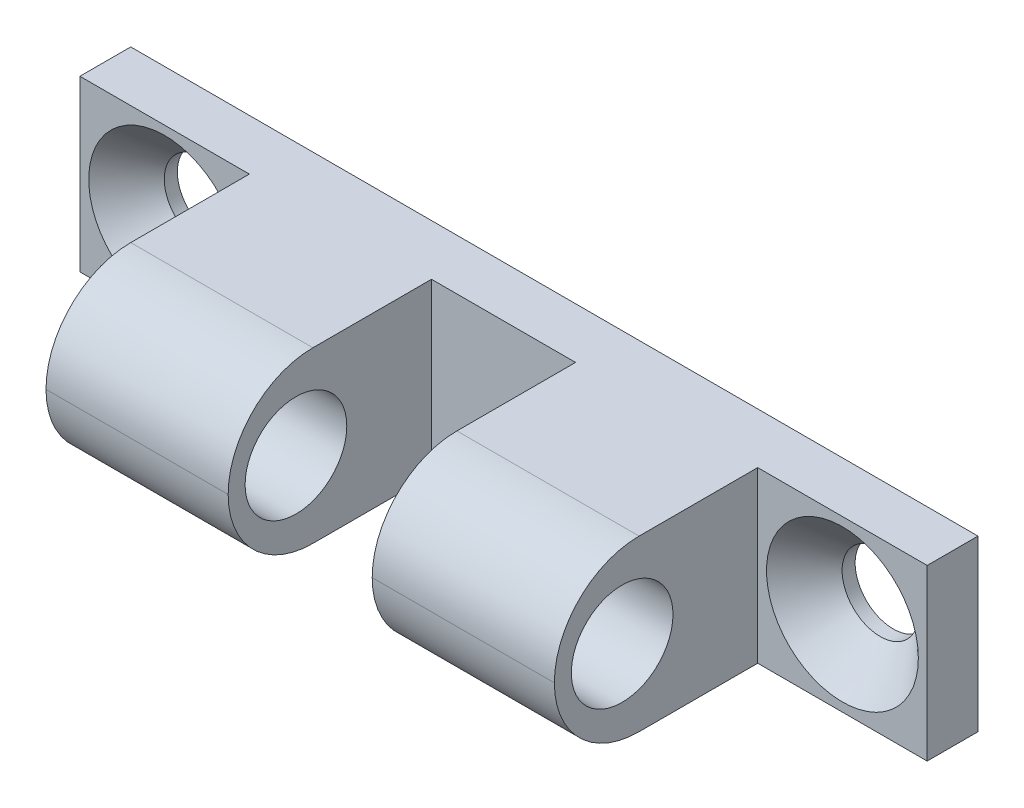
ISO-10303-21;
HEADER;
FILE_DESCRIPTION(('STEP AP214'),'2;1');
FILE_NAME('part.step','',(''),(''),'','','');
FILE_SCHEMA(('AUTOMOTIVE_DESIGN { 1 0 10303 214 1 1 1 1 }'));
ENDSEC;
DATA;
#1=APPLICATION_CONTEXT('core data for automotive mechanical design processes');
#2=APPLICATION_PROTOCOL_DEFINITION('international standard','automotive_design',2000,#1);
#3=PRODUCT_CONTEXT('',#1,'mechanical');
#4=PRODUCT('Part','Part','',(#3));
#5=PRODUCT_RELATED_PRODUCT_CATEGORY('part','',(#4));
#6=PRODUCT_DEFINITION_FORMATION('','',#4);
#7=PRODUCT_DEFINITION_CONTEXT('part definition',#1,'design');
#8=PRODUCT_DEFINITION('design','',#6,#7);
#9=PRODUCT_DEFINITION_SHAPE('','',#8);
#10=(LENGTH_UNIT() NAMED_UNIT(*) SI_UNIT(.MILLI.,.METRE.));
#11=(NAMED_UNIT(*) PLANE_ANGLE_UNIT() SI_UNIT($,.RADIAN.));
#12=(NAMED_UNIT(*) SI_UNIT($,.STERADIAN.) SOLID_ANGLE_UNIT());
#13=UNCERTAINTY_MEASURE_WITH_UNIT(LENGTH_MEASURE(1.E-05),#10,'distance_accuracy_value','');
#14=(GEOMETRIC_REPRESENTATION_CONTEXT(3) GLOBAL_UNCERTAINTY_ASSIGNED_CONTEXT((#13)) GLOBAL_UNIT_ASSIGNED_CONTEXT((#10,
#11,#12)) REPRESENTATION_CONTEXT('',''));
#15=CARTESIAN_POINT('',(0.,0.,0.));
#16=DIRECTION('',(0.,0.,1.));
#17=DIRECTION('',(1.,0.,0.));
#18=AXIS2_PLACEMENT_3D('',#15,#16,#17);
#19=CARTESIAN_POINT('',(15.,5.,0.0896202106810464));
#20=DIRECTION('',(1.,0.,0.));
#21=DIRECTION('',(0.,0.,-1.));
#22=AXIS2_PLACEMENT_3D('',#19,#20,#21);
#23=PLANE('',#22);
#24=CARTESIAN_POINT('',(15.,0.,11.));
#25=DIRECTION('',(1.,0.,0.));
#26=DIRECTION('',(0.,0.,-1.));
#27=AXIS2_PLACEMENT_3D('',#24,#25,#26);
#28=CIRCLE('',#27,3.);
#29=CARTESIAN_POINT('',(15.,0.,8.));
#30=VERTEX_POINT('',#29);
#31=EDGE_CURVE('E224',#30,#30,#28,.T.);
#32=ORIENTED_EDGE('',*,*,#31,.F.);
#33=EDGE_LOOP('',(#32));
#34=FACE_BOUND('',#33,.T.);
#35=CARTESIAN_POINT('',(15.,0.,10.));
#36=DIRECTION('',(1.,0.,0.));
#37=DIRECTION('',(0.,0.,-1.));
#38=AXIS2_PLACEMENT_3D('',#35,#36,#37);
#39=CIRCLE('',#38,5.);
#40=CARTESIAN_POINT('',(15.,5.,10.));
#41=VERTEX_POINT('',#40);
#42=CARTESIAN_POINT('',(15.,0.,15.));
#43=VERTEX_POINT('',#42);
#44=EDGE_CURVE('E238',#41,#43,#39,.T.);
#45=ORIENTED_EDGE('',*,*,#44,.T.);
#46=CARTESIAN_POINT('',(15.,0.,10.));
#47=DIRECTION('',(1.,0.,0.));
#48=DIRECTION('',(0.,0.,-1.));
#49=AXIS2_PLACEMENT_3D('',#46,#47,#48);
#50=CIRCLE('',#49,5.);
#51=CARTESIAN_POINT('',(15.,-5.,10.));
#52=VERTEX_POINT('',#51);
#53=EDGE_CURVE('E240',#43,#52,#50,.T.);
#54=ORIENTED_EDGE('',*,*,#53,.T.);
#55=DIRECTION('',(0.,0.,1.));
#56=VECTOR('',#55,1.);
#57=CARTESIAN_POINT('',(15.,-5.,0.0896202106810464));
#58=LINE('',#57,#56);
#59=CARTESIAN_POINT('',(15.,-5.,3.));
#60=VERTEX_POINT('',#59);
#61=EDGE_CURVE('E140',#60,#52,#58,.T.);
#62=ORIENTED_EDGE('',*,*,#61,.F.);
#63=DIRECTION('',(0.,-1.,0.));
#64=VECTOR('',#63,1.);
#65=CARTESIAN_POINT('',(15.,5.,3.));
#66=LINE('',#65,#64);
#67=CARTESIAN_POINT('',(15.,5.,3.));
#68=VERTEX_POINT('',#67);
#69=EDGE_CURVE('E134',#68,#60,#66,.T.);
#70=ORIENTED_EDGE('',*,*,#69,.F.);
#71=DIRECTION('',(0.,0.,1.));
#72=VECTOR('',#71,1.);
#73=CARTESIAN_POINT('',(15.,5.,0.0896202106810464));
#74=LINE('',#73,#72);
#75=EDGE_CURVE('E137',#68,#41,#74,.T.);
#76=ORIENTED_EDGE('',*,*,#75,.T.);
#77=EDGE_LOOP('',(#45,#54,#62,#70,#76));
#78=FACE_BOUND('',#77,.T.);
#79=ADVANCED_FACE('F34',(#34,#78),#23,.T.);
#80=CARTESIAN_POINT('',(-41.4340287693976,5.,3.));
#81=DIRECTION('',(0.,0.,-1.));
#82=DIRECTION('',(-1.,0.,0.));
#83=AXIS2_PLACEMENT_3D('',#80,#81,#82);
#84=PLANE('',#83);
#85=CARTESIAN_POINT('',(20.,0.,3.));
#86=DIRECTION('',(0.,0.,1.));
#87=DIRECTION('',(1.,0.,0.));
#88=AXIS2_PLACEMENT_3D('',#85,#86,#87);
#89=CIRCLE('',#88,4.48);
#90=CARTESIAN_POINT('',(24.48,0.,3.));
#91=VERTEX_POINT('',#90);
#92=EDGE_CURVE('E387',#91,#91,#89,.T.);
#93=ORIENTED_EDGE('',*,*,#92,.F.);
#94=EDGE_LOOP('',(#93));
#95=FACE_BOUND('',#94,.T.);
#96=DIRECTION('',(1.,0.,0.));
#97=VECTOR('',#96,1.);
#98=CARTESIAN_POINT('',(-41.4340287693976,-5.,3.));
#99=LINE('',#98,#97);
#100=CARTESIAN_POINT('',(25.,-5.,3.));
#101=VERTEX_POINT('',#100);
#102=EDGE_CURVE('E185',#60,#101,#99,.T.);
#103=ORIENTED_EDGE('',*,*,#102,.T.);
#104=DIRECTION('',(0.,-1.,0.));
#105=VECTOR('',#104,1.);
#106=CARTESIAN_POINT('',(25.,5.,3.));
#107=LINE('',#106,#105);
#108=CARTESIAN_POINT('',(25.,5.,3.));
#109=VERTEX_POINT('',#108);
#110=EDGE_CURVE('E145',#109,#101,#107,.T.);
#111=ORIENTED_EDGE('',*,*,#110,.F.);
#112=DIRECTION('',(1.,0.,0.));
#113=VECTOR('',#112,1.);
#114=CARTESIAN_POINT('',(-41.4340287693976,5.,3.));
#115=LINE('',#114,#113);
#116=EDGE_CURVE('E148',#68,#109,#115,.T.);
#117=ORIENTED_EDGE('',*,*,#116,.F.);
#118=ORIENTED_EDGE('',*,*,#69,.T.);
#119=EDGE_LOOP('',(#103,#111,#117,#118));
#120=FACE_BOUND('',#119,.T.);
#121=ADVANCED_FACE('F149',(#95,#120),#84,.F.);
#122=CARTESIAN_POINT('',(25.,5.,0.0896202106812163));
#123=DIRECTION('',(1.,0.,0.));
#124=DIRECTION('',(0.,0.,-1.));
#125=AXIS2_PLACEMENT_3D('',#122,#123,#124);
#126=PLANE('',#125);
#127=DIRECTION('',(0.,0.,1.));
#128=VECTOR('',#127,1.);
#129=CARTESIAN_POINT('',(25.,-5.,0.0896202106812163));
#130=LINE('',#129,#128);
#131=CARTESIAN_POINT('',(25.,-5.,0.));
#132=VERTEX_POINT('',#131);
#133=EDGE_CURVE('E187',#132,#101,#130,.T.);
#134=ORIENTED_EDGE('',*,*,#133,.F.);
#135=DIRECTION('',(0.,-1.,0.));
#136=VECTOR('',#135,1.);
#137=CARTESIAN_POINT('',(25.,5.,0.));
#138=LINE('',#137,#136);
#139=CARTESIAN_POINT('',(25.,5.,0.));
#140=VERTEX_POINT('',#139);
#141=EDGE_CURVE('E217',#140,#132,#138,.T.);
#142=ORIENTED_EDGE('',*,*,#141,.F.);
#143=DIRECTION('',(0.,0.,1.));
#144=VECTOR('',#143,1.);
#145=CARTESIAN_POINT('',(25.,5.,0.0896202106812163));
#146=LINE('',#145,#144);
#147=EDGE_CURVE('E153',#140,#109,#146,.T.);
#148=ORIENTED_EDGE('',*,*,#147,.T.);
#149=ORIENTED_EDGE('',*,*,#110,.T.);
#150=EDGE_LOOP('',(#134,#142,#148,#149));
#151=FACE_BOUND('',#150,.T.);
#152=ADVANCED_FACE('F265',(#151),#126,.T.);
#153=CARTESIAN_POINT('',(-41.4340287693976,5.,0.));
#154=DIRECTION('',(0.,0.,-1.));
#155=DIRECTION('',(-1.,0.,0.));
#156=AXIS2_PLACEMENT_3D('',#153,#154,#155);
#157=PLANE('',#156);
#158=CARTESIAN_POINT('',(-20.,0.,0.));
#159=DIRECTION('',(0.,0.,1.));
#160=DIRECTION('',(1.,0.,0.));
#161=AXIS2_PLACEMENT_3D('',#158,#159,#160);
#162=CIRCLE('',#161,2.25);
#163=CARTESIAN_POINT('',(-17.75,0.,0.));
#164=VERTEX_POINT('',#163);
#165=EDGE_CURVE('E384',#164,#164,#162,.T.);
#166=ORIENTED_EDGE('',*,*,#165,.T.);
#167=EDGE_LOOP('',(#166));
#168=FACE_BOUND('',#167,.T.);
#169=CARTESIAN_POINT('',(20.,0.,0.));
#170=DIRECTION('',(0.,0.,1.));
#171=DIRECTION('',(1.,0.,0.));
#172=AXIS2_PLACEMENT_3D('',#169,#170,#171);
#173=CIRCLE('',#172,2.25);
#174=CARTESIAN_POINT('',(22.25,0.,0.));
#175=VERTEX_POINT('',#174);
#176=EDGE_CURVE('E162',#175,#175,#173,.T.);
#177=ORIENTED_EDGE('',*,*,#176,.T.);
#178=EDGE_LOOP('',(#177));
#179=FACE_BOUND('',#178,.T.);
#180=DIRECTION('',(1.,0.,0.));
#181=VECTOR('',#180,1.);
#182=CARTESIAN_POINT('',(-41.4340287693976,-5.,0.));
#183=LINE('',#182,#181);
#184=CARTESIAN_POINT('',(-25.,-5.,0.));
#185=VERTEX_POINT('',#184);
#186=EDGE_CURVE('E190',#185,#132,#183,.T.);
#187=ORIENTED_EDGE('',*,*,#186,.F.);
#188=DIRECTION('',(0.,-1.,0.));
#189=VECTOR('',#188,1.);
#190=CARTESIAN_POINT('',(-25.,5.,0.));
#191=LINE('',#190,#189);
#192=CARTESIAN_POINT('',(-25.,5.,0.));
#193=VERTEX_POINT('',#192);
#194=EDGE_CURVE('E215',#193,#185,#191,.T.);
#195=ORIENTED_EDGE('',*,*,#194,.F.);
#196=DIRECTION('',(1.,0.,0.));
#197=VECTOR('',#196,1.);
#198=CARTESIAN_POINT('',(-41.4340287693976,5.,0.));
#199=LINE('',#198,#197);
#200=EDGE_CURVE('E166',#193,#140,#199,.T.);
#201=ORIENTED_EDGE('',*,*,#200,.T.);
#202=ORIENTED_EDGE('',*,*,#141,.T.);
#203=EDGE_LOOP('',(#187,#195,#201,#202));
#204=FACE_BOUND('',#203,.T.);
#205=ADVANCED_FACE('F268',(#168,#179,#204),#157,.T.);
#206=CARTESIAN_POINT('',(-25.,5.,0.0896202106811007));
#207=DIRECTION('',(1.,0.,0.));
#208=DIRECTION('',(0.,0.,-1.));
#209=AXIS2_PLACEMENT_3D('',#206,#207,#208);
#210=PLANE('',#209);
#211=DIRECTION('',(0.,0.,1.));
#212=VECTOR('',#211,1.);
#213=CARTESIAN_POINT('',(-25.,-5.,0.0896202106811007));
#214=LINE('',#213,#212);
#215=CARTESIAN_POINT('',(-25.,-5.,3.));
#216=VERTEX_POINT('',#215);
#217=EDGE_CURVE('E193',#185,#216,#214,.T.);
#218=ORIENTED_EDGE('',*,*,#217,.T.);
#219=DIRECTION('',(0.,-1.,0.));
#220=VECTOR('',#219,1.);
#221=CARTESIAN_POINT('',(-25.,5.,3.));
#222=LINE('',#221,#220);
#223=CARTESIAN_POINT('',(-25.,5.,3.));
#224=VERTEX_POINT('',#223);
#225=EDGE_CURVE('E212',#224,#216,#222,.T.);
#226=ORIENTED_EDGE('',*,*,#225,.F.);
#227=DIRECTION('',(0.,0.,1.));
#228=VECTOR('',#227,1.);
#229=CARTESIAN_POINT('',(-25.,5.,0.0896202106811007));
#230=LINE('',#229,#228);
#231=EDGE_CURVE('E169',#193,#224,#230,.T.);
#232=ORIENTED_EDGE('',*,*,#231,.F.);
#233=ORIENTED_EDGE('',*,*,#194,.T.);
#234=EDGE_LOOP('',(#218,#226,#232,#233));
#235=FACE_BOUND('',#234,.T.);
#236=ADVANCED_FACE('F272',(#235),#210,.F.);
#237=CARTESIAN_POINT('',(-41.4340287693976,5.,3.));
#238=DIRECTION('',(0.,0.,-1.));
#239=DIRECTION('',(-1.,0.,0.));
#240=AXIS2_PLACEMENT_3D('',#237,#238,#239);
#241=PLANE('',#240);
#242=CARTESIAN_POINT('',(-20.,0.,3.));
#243=DIRECTION('',(0.,0.,1.));
#244=DIRECTION('',(1.,0.,0.));
#245=AXIS2_PLACEMENT_3D('',#242,#243,#244);
#246=CIRCLE('',#245,4.48);
#247=CARTESIAN_POINT('',(-15.52,0.,3.));
#248=VERTEX_POINT('',#247);
#249=EDGE_CURVE('E375',#248,#248,#246,.T.);
#250=ORIENTED_EDGE('',*,*,#249,.F.);
#251=EDGE_LOOP('',(#250));
#252=FACE_BOUND('',#251,.T.);
#253=DIRECTION('',(1.,0.,0.));
#254=VECTOR('',#253,1.);
#255=CARTESIAN_POINT('',(-41.4340287693976,-5.,3.));
#256=LINE('',#255,#254);
#257=CARTESIAN_POINT('',(-15.,-5.,3.));
#258=VERTEX_POINT('',#257);
#259=EDGE_CURVE('E195',#216,#258,#256,.T.);
#260=ORIENTED_EDGE('',*,*,#259,.T.);
#261=DIRECTION('',(0.,-1.,0.));
#262=VECTOR('',#261,1.);
#263=CARTESIAN_POINT('',(-15.,5.,3.));
#264=LINE('',#263,#262);
#265=CARTESIAN_POINT('',(-15.,5.,3.));
#266=VERTEX_POINT('',#265);
#267=EDGE_CURVE('E209',#266,#258,#264,.T.);
#268=ORIENTED_EDGE('',*,*,#267,.F.);
#269=DIRECTION('',(1.,0.,0.));
#270=VECTOR('',#269,1.);
#271=CARTESIAN_POINT('',(-41.4340287693976,5.,3.));
#272=LINE('',#271,#270);
#273=EDGE_CURVE('E171',#224,#266,#272,.T.);
#274=ORIENTED_EDGE('',*,*,#273,.F.);
#275=ORIENTED_EDGE('',*,*,#225,.T.);
#276=EDGE_LOOP('',(#260,#268,#274,#275));
#277=FACE_BOUND('',#276,.T.);
#278=ADVANCED_FACE('F278',(#252,#277),#241,.F.);
#279=CARTESIAN_POINT('',(-15.,5.,0.0896202106810703));
#280=DIRECTION('',(1.,0.,0.));
#281=DIRECTION('',(0.,0.,-1.));
#282=AXIS2_PLACEMENT_3D('',#279,#280,#281);
#283=PLANE('',#282);
#284=CARTESIAN_POINT('',(-15.,0.,11.));
#285=DIRECTION('',(1.,0.,0.));
#286=DIRECTION('',(0.,0.,-1.));
#287=AXIS2_PLACEMENT_3D('',#284,#285,#286);
#288=CIRCLE('',#287,3.);
#289=CARTESIAN_POINT('',(-15.,0.,8.00000000000001));
#290=VERTEX_POINT('',#289);
#291=EDGE_CURVE('E374',#290,#290,#288,.T.);
#292=ORIENTED_EDGE('',*,*,#291,.T.);
#293=EDGE_LOOP('',(#292));
#294=FACE_BOUND('',#293,.T.);
#295=DIRECTION('',(0.,0.,1.));
#296=VECTOR('',#295,1.);
#297=CARTESIAN_POINT('',(-15.,-5.,0.0896202106810703));
#298=LINE('',#297,#296);
#299=CARTESIAN_POINT('',(-15.,-5.,10.));
#300=VERTEX_POINT('',#299);
#301=EDGE_CURVE('E197',#258,#300,#298,.T.);
#302=ORIENTED_EDGE('',*,*,#301,.T.);
#303=CARTESIAN_POINT('',(-15.,0.,10.));
#304=DIRECTION('',(1.,0.,0.));
#305=DIRECTION('',(0.,0.,-1.));
#306=AXIS2_PLACEMENT_3D('',#303,#304,#305);
#307=CIRCLE('',#306,5.);
#308=CARTESIAN_POINT('',(-15.,0.,15.));
#309=VERTEX_POINT('',#308);
#310=EDGE_CURVE('E236',#300,#309,#307,.F.);
#311=ORIENTED_EDGE('',*,*,#310,.T.);
#312=CARTESIAN_POINT('',(-15.,0.,10.));
#313=DIRECTION('',(1.,0.,0.));
#314=DIRECTION('',(0.,0.,-1.));
#315=AXIS2_PLACEMENT_3D('',#312,#313,#314);
#316=CIRCLE('',#315,5.);
#317=CARTESIAN_POINT('',(-15.,5.,10.));
#318=VERTEX_POINT('',#317);
#319=EDGE_CURVE('E234',#309,#318,#316,.F.);
#320=ORIENTED_EDGE('',*,*,#319,.T.);
#321=DIRECTION('',(0.,0.,1.));
#322=VECTOR('',#321,1.);
#323=CARTESIAN_POINT('',(-15.,5.,0.0896202106810703));
#324=LINE('',#323,#322);
#325=EDGE_CURVE('E173',#266,#318,#324,.T.);
#326=ORIENTED_EDGE('',*,*,#325,.F.);
#327=ORIENTED_EDGE('',*,*,#267,.T.);
#328=EDGE_LOOP('',(#302,#311,#320,#326,#327));
#329=FACE_BOUND('',#328,.T.);
#330=ADVANCED_FACE('F282',(#294,#329),#283,.F.);
#331=CARTESIAN_POINT('',(-4.25,5.,0.0896202106810627));
#332=DIRECTION('',(-1.,0.,0.));
#333=DIRECTION('',(0.,0.,1.));
#334=AXIS2_PLACEMENT_3D('',#331,#332,#333);
#335=PLANE('',#334);
#336=CARTESIAN_POINT('',(-4.25,0.,11.));
#337=DIRECTION('',(-1.,0.,0.));
#338=DIRECTION('',(0.,0.,1.));
#339=AXIS2_PLACEMENT_3D('',#336,#337,#338);
#340=CIRCLE('',#339,3.);
#341=CARTESIAN_POINT('',(-4.25,0.,14.));
#342=VERTEX_POINT('',#341);
#343=EDGE_CURVE('E223',#342,#342,#340,.T.);
#344=ORIENTED_EDGE('',*,*,#343,.T.);
#345=EDGE_LOOP('',(#344));
#346=FACE_BOUND('',#345,.T.);
#347=CARTESIAN_POINT('',(-4.25,0.,10.));
#348=DIRECTION('',(-1.,0.,0.));
#349=DIRECTION('',(0.,0.,1.));
#350=AXIS2_PLACEMENT_3D('',#347,#348,#349);
#351=CIRCLE('',#350,5.);
#352=CARTESIAN_POINT('',(-4.25,5.,10.));
#353=VERTEX_POINT('',#352);
#354=CARTESIAN_POINT('',(-4.25,0.,15.));
#355=VERTEX_POINT('',#354);
#356=EDGE_CURVE('E144',#353,#355,#351,.F.);
#357=ORIENTED_EDGE('',*,*,#356,.T.);
#358=CARTESIAN_POINT('',(-4.25,0.,10.));
#359=DIRECTION('',(-1.,0.,0.));
#360=DIRECTION('',(0.,0.,1.));
#361=AXIS2_PLACEMENT_3D('',#358,#359,#360);
#362=CIRCLE('',#361,5.);
#363=CARTESIAN_POINT('',(-4.25,-5.,10.));
#364=VERTEX_POINT('',#363);
#365=EDGE_CURVE('E226',#355,#364,#362,.F.);
#366=ORIENTED_EDGE('',*,*,#365,.T.);
#367=DIRECTION('',(0.,0.,-1.));
#368=VECTOR('',#367,1.);
#369=CARTESIAN_POINT('',(-4.25,-5.,0.0896202106810627));
#370=LINE('',#369,#368);
#371=CARTESIAN_POINT('',(-4.25,-5.,3.));
#372=VERTEX_POINT('',#371);
#373=EDGE_CURVE('E200',#364,#372,#370,.T.);
#374=ORIENTED_EDGE('',*,*,#373,.T.);
#375=DIRECTION('',(0.,-1.,0.));
#376=VECTOR('',#375,1.);
#377=CARTESIAN_POINT('',(-4.25,5.,3.));
#378=LINE('',#377,#376);
#379=CARTESIAN_POINT('',(-4.25,5.,3.));
#380=VERTEX_POINT('',#379);
#381=EDGE_CURVE('E206',#380,#372,#378,.T.);
#382=ORIENTED_EDGE('',*,*,#381,.F.);
#383=DIRECTION('',(0.,0.,-1.));
#384=VECTOR('',#383,1.);
#385=CARTESIAN_POINT('',(-4.25,5.,0.0896202106810627));
#386=LINE('',#385,#384);
#387=EDGE_CURVE('E176',#353,#380,#386,.T.);
#388=ORIENTED_EDGE('',*,*,#387,.F.);
#389=EDGE_LOOP('',(#357,#366,#374,#382,#388));
#390=FACE_BOUND('',#389,.T.);
#391=ADVANCED_FACE('F290',(#346,#390),#335,.F.);
#392=CARTESIAN_POINT('',(-41.4340287693976,5.,3.));
#393=DIRECTION('',(0.,0.,-1.));
#394=DIRECTION('',(-1.,0.,0.));
#395=AXIS2_PLACEMENT_3D('',#392,#393,#394);
#396=PLANE('',#395);
#397=DIRECTION('',(1.,0.,0.));
#398=VECTOR('',#397,1.);
#399=CARTESIAN_POINT('',(-41.4340287693976,-5.,3.));
#400=LINE('',#399,#398);
#401=CARTESIAN_POINT('',(4.25,-5.,3.));
#402=VERTEX_POINT('',#401);
#403=EDGE_CURVE('E159',#372,#402,#400,.T.);
#404=ORIENTED_EDGE('',*,*,#403,.T.);
#405=DIRECTION('',(0.,-1.,0.));
#406=VECTOR('',#405,1.);
#407=CARTESIAN_POINT('',(4.25,5.,3.));
#408=LINE('',#407,#406);
#409=CARTESIAN_POINT('',(4.25,5.,3.));
#410=VERTEX_POINT('',#409);
#411=EDGE_CURVE('E183',#410,#402,#408,.T.);
#412=ORIENTED_EDGE('',*,*,#411,.F.);
#413=DIRECTION('',(1.,0.,0.));
#414=VECTOR('',#413,1.);
#415=CARTESIAN_POINT('',(-41.4340287693976,5.,3.));
#416=LINE('',#415,#414);
#417=EDGE_CURVE('E178',#380,#410,#416,.T.);
#418=ORIENTED_EDGE('',*,*,#417,.F.);
#419=ORIENTED_EDGE('',*,*,#381,.T.);
#420=EDGE_LOOP('',(#404,#412,#418,#419));
#421=FACE_BOUND('',#420,.T.);
#422=ADVANCED_FACE('F295',(#421),#396,.F.);
#423=CARTESIAN_POINT('',(4.25,5.,0.0896202106810627));
#424=DIRECTION('',(-1.,0.,0.));
#425=DIRECTION('',(0.,0.,1.));
#426=AXIS2_PLACEMENT_3D('',#423,#424,#425);
#427=PLANE('',#426);
#428=CARTESIAN_POINT('',(4.25,0.,11.));
#429=DIRECTION('',(-1.,0.,0.));
#430=DIRECTION('',(0.,0.,1.));
#431=AXIS2_PLACEMENT_3D('',#428,#429,#430);
#432=CIRCLE('',#431,3.);
#433=CARTESIAN_POINT('',(4.25,0.,14.));
#434=VERTEX_POINT('',#433);
#435=EDGE_CURVE('E220',#434,#434,#432,.T.);
#436=ORIENTED_EDGE('',*,*,#435,.F.);
#437=EDGE_LOOP('',(#436));
#438=FACE_BOUND('',#437,.T.);
#439=DIRECTION('',(0.,0.,-1.));
#440=VECTOR('',#439,1.);
#441=CARTESIAN_POINT('',(4.25,-5.,0.0896202106810627));
#442=LINE('',#441,#440);
#443=CARTESIAN_POINT('',(4.25,-5.,10.));
#444=VERTEX_POINT('',#443);
#445=EDGE_CURVE('E157',#444,#402,#442,.T.);
#446=ORIENTED_EDGE('',*,*,#445,.F.);
#447=CARTESIAN_POINT('',(4.25,0.,10.));
#448=DIRECTION('',(-1.,0.,0.));
#449=DIRECTION('',(0.,0.,1.));
#450=AXIS2_PLACEMENT_3D('',#447,#448,#449);
#451=CIRCLE('',#450,5.);
#452=CARTESIAN_POINT('',(4.25,0.,15.));
#453=VERTEX_POINT('',#452);
#454=EDGE_CURVE('E56',#444,#453,#451,.T.);
#455=ORIENTED_EDGE('',*,*,#454,.T.);
#456=CARTESIAN_POINT('',(4.25,0.,10.));
#457=DIRECTION('',(-1.,0.,0.));
#458=DIRECTION('',(0.,0.,1.));
#459=AXIS2_PLACEMENT_3D('',#456,#457,#458);
#460=CIRCLE('',#459,5.);
#461=CARTESIAN_POINT('',(4.25,5.,10.));
#462=VERTEX_POINT('',#461);
#463=EDGE_CURVE('E51',#453,#462,#460,.T.);
#464=ORIENTED_EDGE('',*,*,#463,.T.);
#465=DIRECTION('',(0.,0.,-1.));
#466=VECTOR('',#465,1.);
#467=CARTESIAN_POINT('',(4.25,5.,0.0896202106810627));
#468=LINE('',#467,#466);
#469=EDGE_CURVE('E181',#462,#410,#468,.T.);
#470=ORIENTED_EDGE('',*,*,#469,.T.);
#471=ORIENTED_EDGE('',*,*,#411,.T.);
#472=EDGE_LOOP('',(#446,#455,#464,#470,#471));
#473=FACE_BOUND('',#472,.T.);
#474=ADVANCED_FACE('F296',(#438,#473),#427,.T.);
#475=CARTESIAN_POINT('',(-41.4340287693976,5.,0.0896202106810627));
#476=DIRECTION('',(0.,1.,0.));
#477=DIRECTION('',(0.,0.,1.));
#478=AXIS2_PLACEMENT_3D('',#475,#476,#477);
#479=PLANE('',#478);
#480=ORIENTED_EDGE('',*,*,#469,.F.);
#481=DIRECTION('',(1.,0.,0.));
#482=VECTOR('',#481,1.);
#483=CARTESIAN_POINT('',(15.,5.,10.));
#484=LINE('',#483,#482);
#485=EDGE_CURVE('E11',#462,#41,#484,.T.);
#486=ORIENTED_EDGE('',*,*,#485,.T.);
#487=ORIENTED_EDGE('',*,*,#75,.F.);
#488=ORIENTED_EDGE('',*,*,#116,.T.);
#489=ORIENTED_EDGE('',*,*,#147,.F.);
#490=ORIENTED_EDGE('',*,*,#200,.F.);
#491=ORIENTED_EDGE('',*,*,#231,.T.);
#492=ORIENTED_EDGE('',*,*,#273,.T.);
#493=ORIENTED_EDGE('',*,*,#325,.T.);
#494=DIRECTION('',(1.,0.,0.));
#495=VECTOR('',#494,1.);
#496=CARTESIAN_POINT('',(-4.25,5.,10.));
#497=LINE('',#496,#495);
#498=EDGE_CURVE('E43',#318,#353,#497,.T.);
#499=ORIENTED_EDGE('',*,*,#498,.T.);
#500=ORIENTED_EDGE('',*,*,#387,.T.);
#501=ORIENTED_EDGE('',*,*,#417,.T.);
#502=EDGE_LOOP('',(#480,#486,#487,#488,#489,#490,#491,#492,#493,#499,#500,#501));
#503=FACE_BOUND('',#502,.T.);
#504=ADVANCED_FACE('F155',(#503),#479,.T.);
#505=CARTESIAN_POINT('',(-41.4340287693976,-5.,0.0896202106810627));
#506=DIRECTION('',(0.,1.,0.));
#507=DIRECTION('',(0.,0.,1.));
#508=AXIS2_PLACEMENT_3D('',#505,#506,#507);
#509=PLANE('',#508);
#510=ORIENTED_EDGE('',*,*,#373,.F.);
#511=DIRECTION('',(1.,0.,0.));
#512=VECTOR('',#511,1.);
#513=CARTESIAN_POINT('',(-41.4340287693976,-5.,10.));
#514=LINE('',#513,#512);
#515=EDGE_CURVE('E231',#364,#300,#514,.F.);
#516=ORIENTED_EDGE('',*,*,#515,.T.);
#517=ORIENTED_EDGE('',*,*,#301,.F.);
#518=ORIENTED_EDGE('',*,*,#259,.F.);
#519=ORIENTED_EDGE('',*,*,#217,.F.);
#520=ORIENTED_EDGE('',*,*,#186,.T.);
#521=ORIENTED_EDGE('',*,*,#133,.T.);
#522=ORIENTED_EDGE('',*,*,#102,.F.);
#523=ORIENTED_EDGE('',*,*,#61,.T.);
#524=DIRECTION('',(1.,0.,0.));
#525=VECTOR('',#524,1.);
#526=CARTESIAN_POINT('',(-41.4340287693976,-5.,10.));
#527=LINE('',#526,#525);
#528=EDGE_CURVE('E228',#52,#444,#527,.F.);
#529=ORIENTED_EDGE('',*,*,#528,.T.);
#530=ORIENTED_EDGE('',*,*,#445,.T.);
#531=ORIENTED_EDGE('',*,*,#403,.F.);
#532=EDGE_LOOP('',(#510,#516,#517,#518,#519,#520,#521,#522,#523,#529,#530,#531));
#533=FACE_BOUND('',#532,.T.);
#534=ADVANCED_FACE('F260',(#533),#509,.F.);
#535=CARTESIAN_POINT('',(20.,0.,3.));
#536=DIRECTION('',(0.,0.,1.));
#537=DIRECTION('',(1.,0.,0.));
#538=AXIS2_PLACEMENT_3D('',#535,#536,#537);
#539=CYLINDRICAL_SURFACE('',#538,2.25);
#540=ORIENTED_EDGE('',*,*,#176,.F.);
#541=EDGE_LOOP('',(#540));
#542=FACE_BOUND('',#541,.T.);
#543=CARTESIAN_POINT('',(20.,0.,0.769999999999996));
#544=DIRECTION('',(0.,0.,1.));
#545=DIRECTION('',(1.,0.,0.));
#546=AXIS2_PLACEMENT_3D('',#543,#544,#545);
#547=CIRCLE('',#546,2.25);
#548=CARTESIAN_POINT('',(22.25,0.,0.769999999999996));
#549=VERTEX_POINT('',#548);
#550=EDGE_CURVE('E389',#549,#549,#547,.T.);
#551=ORIENTED_EDGE('',*,*,#550,.T.);
#552=EDGE_LOOP('',(#551));
#553=FACE_BOUND('',#552,.T.);
#554=ADVANCED_FACE('F340',(#542,#553),#539,.F.);
#555=CARTESIAN_POINT('',(20.,0.,3.));
#556=DIRECTION('',(0.,0.,1.));
#557=DIRECTION('',(1.,0.,0.));
#558=AXIS2_PLACEMENT_3D('',#555,#556,#557);
#559=CONICAL_SURFACE('',#558,4.48,0.785398163397448);
#560=ORIENTED_EDGE('',*,*,#550,.F.);
#561=EDGE_LOOP('',(#560));
#562=FACE_BOUND('',#561,.T.);
#563=ORIENTED_EDGE('',*,*,#92,.T.);
#564=EDGE_LOOP('',(#563));
#565=FACE_BOUND('',#564,.T.);
#566=ADVANCED_FACE('F345',(#562,#565),#559,.F.);
#567=CARTESIAN_POINT('',(-20.,0.,3.));
#568=DIRECTION('',(0.,0.,1.));
#569=DIRECTION('',(1.,0.,0.));
#570=AXIS2_PLACEMENT_3D('',#567,#568,#569);
#571=CYLINDRICAL_SURFACE('',#570,2.25);
#572=ORIENTED_EDGE('',*,*,#165,.F.);
#573=EDGE_LOOP('',(#572));
#574=FACE_BOUND('',#573,.T.);
#575=CARTESIAN_POINT('',(-20.,0.,0.769999999999996));
#576=DIRECTION('',(0.,0.,1.));
#577=DIRECTION('',(1.,0.,0.));
#578=AXIS2_PLACEMENT_3D('',#575,#576,#577);
#579=CIRCLE('',#578,2.25);
#580=CARTESIAN_POINT('',(-17.75,0.,0.769999999999996));
#581=VERTEX_POINT('',#580);
#582=EDGE_CURVE('E378',#581,#581,#579,.T.);
#583=ORIENTED_EDGE('',*,*,#582,.T.);
#584=EDGE_LOOP('',(#583));
#585=FACE_BOUND('',#584,.T.);
#586=ADVANCED_FACE('F349',(#574,#585),#571,.F.);
#587=CARTESIAN_POINT('',(-20.,0.,3.));
#588=DIRECTION('',(0.,0.,1.));
#589=DIRECTION('',(1.,0.,0.));
#590=AXIS2_PLACEMENT_3D('',#587,#588,#589);
#591=CONICAL_SURFACE('',#590,4.48,0.785398163397448);
#592=ORIENTED_EDGE('',*,*,#582,.F.);
#593=EDGE_LOOP('',(#592));
#594=FACE_BOUND('',#593,.T.);
#595=ORIENTED_EDGE('',*,*,#249,.T.);
#596=EDGE_LOOP('',(#595));
#597=FACE_BOUND('',#596,.T.);
#598=ADVANCED_FACE('F353',(#594,#597),#591,.F.);
#599=CARTESIAN_POINT('',(-25.,0.,11.));
#600=DIRECTION('',(1.,0.,0.));
#601=DIRECTION('',(0.,0.,-1.));
#602=AXIS2_PLACEMENT_3D('',#599,#600,#601);
#603=CYLINDRICAL_SURFACE('',#602,3.);
#604=ORIENTED_EDGE('',*,*,#435,.T.);
#605=EDGE_LOOP('',(#604));
#606=FACE_BOUND('',#605,.T.);
#607=ORIENTED_EDGE('',*,*,#31,.T.);
#608=EDGE_LOOP('',(#607));
#609=FACE_BOUND('',#608,.T.);
#610=ADVANCED_FACE('F357',(#606,#609),#603,.F.);
#611=ORIENTED_EDGE('',*,*,#343,.F.);
#612=EDGE_LOOP('',(#611));
#613=FACE_BOUND('',#612,.T.);
#614=ORIENTED_EDGE('',*,*,#291,.F.);
#615=EDGE_LOOP('',(#614));
#616=FACE_BOUND('',#615,.T.);
#617=ADVANCED_FACE('F305',(#613,#616),#603,.F.);
#618=CARTESIAN_POINT('',(-41.4340287693976,0.,10.));
#619=DIRECTION('',(-1.,0.,0.));
#620=DIRECTION('',(0.,0.,1.));
#621=AXIS2_PLACEMENT_3D('',#618,#619,#620);
#622=CYLINDRICAL_SURFACE('',#621,5.);
#623=ORIENTED_EDGE('',*,*,#498,.F.);
#624=ORIENTED_EDGE('',*,*,#319,.F.);
#625=DIRECTION('',(1.,0.,0.));
#626=VECTOR('',#625,1.);
#627=CARTESIAN_POINT('',(-15.,0.,15.));
#628=LINE('',#627,#626);
#629=EDGE_CURVE('E244',#355,#309,#628,.F.);
#630=ORIENTED_EDGE('',*,*,#629,.F.);
#631=ORIENTED_EDGE('',*,*,#356,.F.);
#632=EDGE_LOOP('',(#623,#624,#630,#631));
#633=FACE_BOUND('',#632,.T.);
#634=ADVANCED_FACE('F285',(#633),#622,.T.);
#635=CARTESIAN_POINT('',(-41.4340287693976,0.,10.));
#636=DIRECTION('',(1.,0.,0.));
#637=DIRECTION('',(0.,0.,-1.));
#638=AXIS2_PLACEMENT_3D('',#635,#636,#637);
#639=CYLINDRICAL_SURFACE('',#638,5.);
#640=ORIENTED_EDGE('',*,*,#310,.F.);
#641=ORIENTED_EDGE('',*,*,#515,.F.);
#642=ORIENTED_EDGE('',*,*,#365,.F.);
#643=ORIENTED_EDGE('',*,*,#629,.T.);
#644=EDGE_LOOP('',(#640,#641,#642,#643));
#645=FACE_BOUND('',#644,.T.);
#646=ADVANCED_FACE('F298',(#645),#639,.T.);
#647=CARTESIAN_POINT('',(-41.4340287693976,0.,10.));
#648=DIRECTION('',(-1.,0.,0.));
#649=DIRECTION('',(0.,0.,1.));
#650=AXIS2_PLACEMENT_3D('',#647,#648,#649);
#651=CYLINDRICAL_SURFACE('',#650,5.);
#652=ORIENTED_EDGE('',*,*,#485,.F.);
#653=ORIENTED_EDGE('',*,*,#463,.F.);
#654=DIRECTION('',(1.,0.,0.));
#655=VECTOR('',#654,1.);
#656=CARTESIAN_POINT('',(4.25,0.,15.));
#657=LINE('',#656,#655);
#658=EDGE_CURVE('E38',#43,#453,#657,.F.);
#659=ORIENTED_EDGE('',*,*,#658,.F.);
#660=ORIENTED_EDGE('',*,*,#44,.F.);
#661=EDGE_LOOP('',(#652,#653,#659,#660));
#662=FACE_BOUND('',#661,.T.);
#663=ADVANCED_FACE('F36',(#662),#651,.T.);
#664=CARTESIAN_POINT('',(-41.4340287693976,0.,10.));
#665=DIRECTION('',(1.,0.,0.));
#666=DIRECTION('',(0.,0.,-1.));
#667=AXIS2_PLACEMENT_3D('',#664,#665,#666);
#668=CYLINDRICAL_SURFACE('',#667,5.);
#669=ORIENTED_EDGE('',*,*,#454,.F.);
#670=ORIENTED_EDGE('',*,*,#528,.F.);
#671=ORIENTED_EDGE('',*,*,#53,.F.);
#672=ORIENTED_EDGE('',*,*,#658,.T.);
#673=EDGE_LOOP('',(#669,#670,#671,#672));
#674=FACE_BOUND('',#673,.T.);
#675=ADVANCED_FACE('F255',(#674),#668,.T.);
#676=CLOSED_SHELL('',(#79,#121,#152,#205,#236,#278,#330,#391,#422,#474,#504,#534,#554,#566,#586,
#598,#610,#617,#634,#646,#663,#675));
#677=MANIFOLD_SOLID_BREP('B2',#676);
#678=ADVANCED_BREP_SHAPE_REPRESENTATION('',(#18,#677),#14);
#679=SHAPE_DEFINITION_REPRESENTATION(#9,#678);
ENDSEC;
END-ISO-10303-21;
